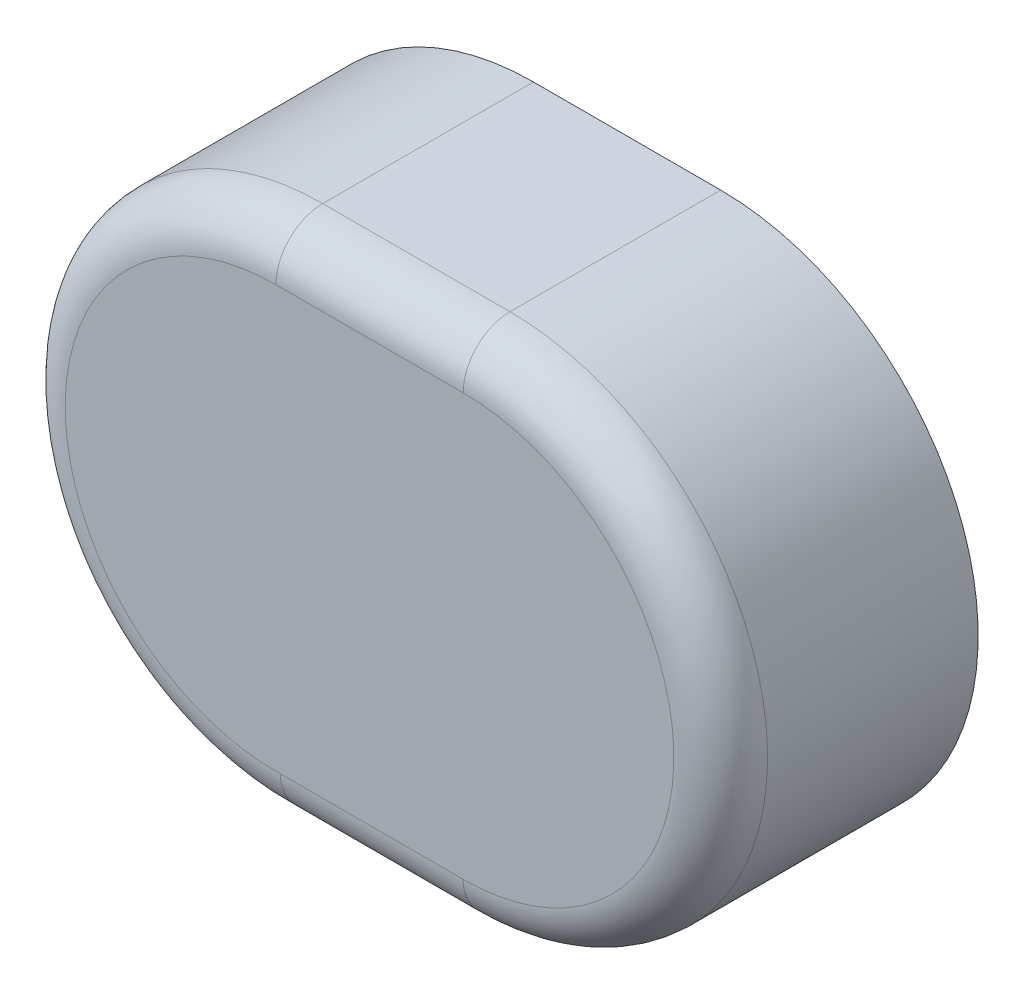
ISO-10303-21;
HEADER;
FILE_DESCRIPTION(('STEP AP214'),'2;1');
FILE_NAME('part.step','',(''),(''),'','','');
FILE_SCHEMA(('AUTOMOTIVE_DESIGN { 1 0 10303 214 1 1 1 1 }'));
ENDSEC;
DATA;
#1=APPLICATION_CONTEXT('core data for automotive mechanical design processes');
#2=APPLICATION_PROTOCOL_DEFINITION('international standard','automotive_design',2000,#1);
#3=PRODUCT_CONTEXT('',#1,'mechanical');
#4=PRODUCT('Part','Part','',(#3));
#5=PRODUCT_RELATED_PRODUCT_CATEGORY('part','',(#4));
#6=PRODUCT_DEFINITION_FORMATION('','',#4);
#7=PRODUCT_DEFINITION_CONTEXT('part definition',#1,'design');
#8=PRODUCT_DEFINITION('design','',#6,#7);
#9=PRODUCT_DEFINITION_SHAPE('','',#8);
#10=(LENGTH_UNIT() NAMED_UNIT(*) SI_UNIT(.MILLI.,.METRE.));
#11=(NAMED_UNIT(*) PLANE_ANGLE_UNIT() SI_UNIT($,.RADIAN.));
#12=(NAMED_UNIT(*) SI_UNIT($,.STERADIAN.) SOLID_ANGLE_UNIT());
#13=UNCERTAINTY_MEASURE_WITH_UNIT(LENGTH_MEASURE(1.E-05),#10,'distance_accuracy_value','');
#14=(GEOMETRIC_REPRESENTATION_CONTEXT(3) GLOBAL_UNCERTAINTY_ASSIGNED_CONTEXT((#13)) GLOBAL_UNIT_ASSIGNED_CONTEXT((#10,
#11,#12)) REPRESENTATION_CONTEXT('',''));
#15=CARTESIAN_POINT('',(0.,0.,0.));
#16=DIRECTION('',(0.,0.,1.));
#17=DIRECTION('',(1.,0.,0.));
#18=AXIS2_PLACEMENT_3D('',#15,#16,#17);
#19=CARTESIAN_POINT('',(-0.4,0.,1.1));
#20=DIRECTION('',(0.,0.,1.));
#21=DIRECTION('',(1.,0.,0.));
#22=AXIS2_PLACEMENT_3D('',#19,#20,#21);
#23=PLANE('',#22);
#24=DIRECTION('',(0.999999965445683,-0.000262885207739422,0.));
#25=VECTOR('',#24,1.);
#26=CARTESIAN_POINT('',(-0.380779125953,-0.899794729347,1.1));
#27=LINE('',#26,#25);
#28=CARTESIAN_POINT('',(-0.380779125953001,-0.899794729347,1.1));
#29=VERTEX_POINT('',#28);
#30=CARTESIAN_POINT('',(0.399474212285497,-0.899999846415,1.10000000000012));
#31=VERTEX_POINT('',#30);
#32=EDGE_CURVE('E66',#29,#31,#27,.T.);
#33=ORIENTED_EDGE('',*,*,#32,.T.);
#34=CARTESIAN_POINT('',(0.400000000000704,0.,1.10000000000023));
#35=DIRECTION('',(0.,0.,1.));
#36=DIRECTION('',(1.,0.,0.));
#37=AXIS2_PLACEMENT_3D('',#34,#35,#36);
#38=CIRCLE('',#37,0.900000075143295);
#39=CARTESIAN_POINT('',(0.4,0.9,1.1));
#40=VERTEX_POINT('',#39);
#41=EDGE_CURVE('E22',#31,#40,#38,.T.);
#42=ORIENTED_EDGE('',*,*,#41,.T.);
#43=DIRECTION('',(1.,0.,0.));
#44=VECTOR('',#43,1.);
#45=CARTESIAN_POINT('',(-0.4,0.9,1.1));
#46=LINE('',#45,#44);
#47=CARTESIAN_POINT('',(-0.4,0.899999999577645,1.1));
#48=VERTEX_POINT('',#47);
#49=EDGE_CURVE('E71',#40,#48,#46,.F.);
#50=ORIENTED_EDGE('',*,*,#49,.T.);
#51=CARTESIAN_POINT('',(-0.4,-2.02745806254789E-13,1.1));
#52=DIRECTION('',(0.,0.,1.));
#53=DIRECTION('',(1.,0.,0.));
#54=AXIS2_PLACEMENT_3D('',#51,#52,#53);
#55=CIRCLE('',#54,0.899999998310782);
#56=EDGE_CURVE('E74',#29,#48,#55,.F.);
#57=ORIENTED_EDGE('',*,*,#56,.F.);
#58=EDGE_LOOP('',(#33,#42,#50,#57));
#59=FACE_BOUND('',#58,.T.);
#60=ADVANCED_FACE('F17',(#59),#23,.T.);
#61=CARTESIAN_POINT('',(-0.4,-2.02745806254789E-13,0.9));
#62=DIRECTION('',(0.,0.,1.));
#63=DIRECTION('',(1.,0.,0.));
#64=AXIS2_PLACEMENT_3D('',#61,#62,#63);
#65=TOROIDAL_SURFACE('',#64,0.900000000000203,0.2);
#66=CARTESIAN_POINT('',(-0.4,0.9,0.9));
#67=DIRECTION('',(1.,0.,0.));
#68=DIRECTION('',(0.,1.,0.));
#69=AXIS2_PLACEMENT_3D('',#66,#67,#68);
#70=CIRCLE('',#69,0.2);
#71=CARTESIAN_POINT('',(-0.4,1.1,0.9));
#72=VERTEX_POINT('',#71);
#73=EDGE_CURVE('E83',#72,#48,#70,.T.);
#74=ORIENTED_EDGE('',*,*,#73,.F.);
#75=CARTESIAN_POINT('',(-0.4,0.,0.9));
#76=DIRECTION('',(0.,0.,-1.));
#77=DIRECTION('',(-1.,0.,0.));
#78=AXIS2_PLACEMENT_3D('',#75,#76,#77);
#79=CIRCLE('',#78,1.1);
#80=CARTESIAN_POINT('',(-0.378777908657648,-1.09979526405577,0.9));
#81=VERTEX_POINT('',#80);
#82=EDGE_CURVE('E82',#81,#72,#79,.T.);
#83=ORIENTED_EDGE('',*,*,#82,.F.);
#84=CARTESIAN_POINT('',(-0.378777908635561,-1.09979526405555,0.9));
#85=CARTESIAN_POINT('',(-0.378777842204827,-1.0998048210349,0.911250741551168));
#86=CARTESIAN_POINT('',(-0.378786937547882,-1.09884648962954,0.922498627818875));
#87=CARTESIAN_POINT('',(-0.378822962144186,-1.09506440034814,0.94466864361749));
#88=CARTESIAN_POINT('',(-0.378849879014467,-1.09224193773358,0.955590993838411));
#89=CARTESIAN_POINT('',(-0.378921075666668,-1.0847999385115,0.976811562049376));
#90=CARTESIAN_POINT('',(-0.378965363930232,-1.08017952405656,0.987109472314333));
#91=CARTESIAN_POINT('',(-0.379070341785508,-1.06927745845309,1.00678063740502));
#92=CARTESIAN_POINT('',(-0.379131026702489,-1.06299628080365,1.01615415473961));
#93=CARTESIAN_POINT('',(-0.379267506887356,-1.04895038107286,1.03371282067333));
#94=CARTESIAN_POINT('',(-0.379343300537055,-1.04118581786979,1.0418980963742));
#95=CARTESIAN_POINT('',(-0.379508386361887,-1.02438845910296,1.0568534085059));
#96=CARTESIAN_POINT('',(-0.379597685795761,-1.01535498174304,1.06362267920821));
#97=CARTESIAN_POINT('',(-0.379787778560933,-0.996274080809439,1.07555198563839));
#98=CARTESIAN_POINT('',(-0.379888579419048,-0.986225993750485,1.08071095920382));
#99=CARTESIAN_POINT('',(-0.380099088092223,-0.965421604535757,1.08925991942117));
#100=CARTESIAN_POINT('',(-0.380208779895724,-0.954666581816015,1.09265300787131));
#101=CARTESIAN_POINT('',(-0.380405318036238,-0.935573216478016,1.09695050093451));
#102=CARTESIAN_POINT('',(-0.380490769419831,-0.927326113091377,1.09827085569629));
#103=CARTESIAN_POINT('',(-0.38064402872097,-0.91263772837508,1.09969082850433));
#104=CARTESIAN_POINT('',(-0.380711385660316,-0.906216333564457,1.10000104534258));
#105=CARTESIAN_POINT('',(-0.380779125936381,-0.899794731036452,1.1));
#106=B_SPLINE_CURVE_WITH_KNOTS('',3,(#84,#85,#86,#87,#88,#89,#90,#91,#92,#93,#94,#95,#96,#97,
#98,#99,#100,#101,#102,#103,#104,#105),.UNSPECIFIED.,.F.,.F.,(4,2,2,2,2,2,2,2,2,2,4),(0.,
0.0337073897405711,0.0673913830505227,0.10109184319901,0.13478270537321,0.168469961102774,
0.202175386956016,0.23590299837384,0.269571165172142,0.29456536907765,0.313824089053903),.UNSPECIFIED.);
#107=EDGE_CURVE('E95',#29,#81,#106,.F.);
#108=ORIENTED_EDGE('',*,*,#107,.F.);
#109=ORIENTED_EDGE('',*,*,#56,.T.);
#110=EDGE_LOOP('',(#74,#83,#108,#109));
#111=FACE_BOUND('',#110,.T.);
#112=ADVANCED_FACE('F115',(#111),#65,.T.);
#113=CARTESIAN_POINT('',(-0.400236549181,-0.899789615799,0.9));
#114=DIRECTION('',(-0.999999965443406,0.000262893868867007,0.));
#115=DIRECTION('',(-0.000262893868867007,-0.999999965443406,0.));
#116=AXIS2_PLACEMENT_3D('',#113,#114,#115);
#117=CYLINDRICAL_SURFACE('',#116,0.2);
#118=ORIENTED_EDGE('',*,*,#107,.T.);
#119=DIRECTION('',(-0.999999965443406,0.000262893868867007,0.));
#120=VECTOR('',#119,1.);
#121=CARTESIAN_POINT('',(-0.378777908656,-1.099795264056,0.9));
#122=LINE('',#121,#120);
#123=CARTESIAN_POINT('',(0.399421633509,-1.09999984795121,0.9));
#124=VERTEX_POINT('',#123);
#125=EDGE_CURVE('E159',#81,#124,#122,.F.);
#126=ORIENTED_EDGE('',*,*,#125,.T.);
#127=CARTESIAN_POINT('',(0.399474212284995,-0.899999846415,1.10000000000025));
#128=CARTESIAN_POINT('',(0.399472848150148,-0.903272341829197,1.100000069418));
#129=CARTESIAN_POINT('',(0.399471490013461,-0.90654483133912,1.09991968342525));
#130=CARTESIAN_POINT('',(0.399468790259264,-0.913081929811225,1.09959849905725));
#131=CARTESIAN_POINT('',(0.399467448641755,-0.916346538773405,1.09935770068196));
#132=CARTESIAN_POINT('',(0.399464786448776,-0.92286000740981,1.09871618998729));
#133=CARTESIAN_POINT('',(0.399463465873306,-0.926108867084032,1.09831547766787));
#134=CARTESIAN_POINT('',(0.399460850189564,-0.932583011432703,1.09735512631835));
#135=CARTESIAN_POINT('',(0.399459555081291,-0.935808296107145,1.0967954872882));
#136=CARTESIAN_POINT('',(0.39945699467219,-0.9422275201756,1.09551862487333));
#137=CARTESIAN_POINT('',(0.399455729371362,-0.945421459569604,1.09480140148855));
#138=CARTESIAN_POINT('',(0.399453232816043,-0.951770298675267,1.09321109978944));
#139=CARTESIAN_POINT('',(0.399452001561552,-0.954925198386913,1.09233802147507));
#140=CARTESIAN_POINT('',(0.399449577228204,-0.961188357678076,1.09043811281793));
#141=CARTESIAN_POINT('',(0.399448384149348,-0.964296617257578,1.08941128247512));
#142=CARTESIAN_POINT('',(0.39944604017696,-0.970459008221036,1.08720634359814));
#143=CARTESIAN_POINT('',(0.399444889283429,-0.973513139604976,1.08602823506393));
#144=CARTESIAN_POINT('',(0.399442633562676,-0.979559916506415,1.08352357794058));
#145=CARTESIAN_POINT('',(0.399441528735454,-0.982552562023895,1.08219702935139));
#146=CARTESIAN_POINT('',(0.399439368890725,-0.988469157648223,1.07939868789792));
#147=CARTESIAN_POINT('',(0.399438313873218,-0.99139310775505,1.0779268950336));
#148=CARTESIAN_POINT('',(0.399436257245306,-0.997165268506623,1.07484161070562));
#149=CARTESIAN_POINT('',(0.399435255634901,-1.00001347915135,1.07322811924192));
#150=CARTESIAN_POINT('',(0.399433309264533,-1.00562729939037,1.06986332475802));
#151=CARTESIAN_POINT('',(0.39943236450457,-1.00839290898466,1.06811202173779));
#152=CARTESIAN_POINT('',(0.399430535116777,-1.01383486452759,1.06447582318303));
#153=CARTESIAN_POINT('',(0.399429650488946,-1.01651121047621,1.06259092764847));
#154=CARTESIAN_POINT('',(0.399427944478309,-1.02176819117654,1.05869208494355));
#155=CARTESIAN_POINT('',(0.399427123095503,-1.02434882592822,1.05667813777315));
#156=CARTESIAN_POINT('',(0.399425546512326,-1.02940816726002,1.05252604357167));
#157=CARTESIAN_POINT('',(0.399424791311955,-1.03188687384011,1.05038789654055));
#158=CARTESIAN_POINT('',(0.399423349849364,-1.03673638740797,1.04599255360112));
#159=CARTESIAN_POINT('',(0.399422663587144,-1.03910719439571,1.04373535769277));
#160=CARTESIAN_POINT('',(0.399421362569167,-1.04373519729767,1.03910735478152));
#161=CARTESIAN_POINT('',(0.399420747813409,-1.04599239321185,1.03673654777858));
#162=CARTESIAN_POINT('',(0.399419592184048,-1.05038773618451,1.03188703415988));
#163=CARTESIAN_POINT('',(0.399419051310444,-1.05252588324294,1.02940832754409));
#164=CARTESIAN_POINT('',(0.39941804562376,-1.05667797752102,1.02434898612101));
#165=CARTESIAN_POINT('',(0.399417580810681,-1.05869192474063,1.02176835131371));
#166=CARTESIAN_POINT('',(0.39941672922192,-1.06259076756625,1.0165113704829));
#167=CARTESIAN_POINT('',(0.399416342446238,-1.06447566317224,1.01383502445937));
#168=CARTESIAN_POINT('',(0.399415648703996,-1.0681118618924,1.0083930687481));
#169=CARTESIAN_POINT('',(0.399415341737436,-1.06986316500656,1.00562745906034));
#170=CARTESIAN_POINT('',(0.399414809176908,-1.07322795970105,1.00001363861659));
#171=CARTESIAN_POINT('',(0.399414583582939,-1.07484145128136,0.997165427860578));
#172=CARTESIAN_POINT('',(0.399414215120225,-1.07792673586547,0.991393266869477));
#173=CARTESIAN_POINT('',(0.399414072251479,-1.07939852886924,0.988469316634373));
#174=CARTESIAN_POINT('',(0.399413870378983,-1.0821968706246,0.982552720737414));
#175=CARTESIAN_POINT('',(0.399413811375233,-1.08352341937615,0.979560075075547));
#176=CARTESIAN_POINT('',(0.399413778158158,-1.08602807684726,0.973513297870186));
#177=CARTESIAN_POINT('',(0.399413803944833,-1.08720618556678,0.970459166326682));
#178=CARTESIAN_POINT('',(0.399413941018735,-1.08941112483735,0.964296775029929));
#179=CARTESIAN_POINT('',(0.399414052305963,-1.09043795538837,0.961188515276673));
#180=CARTESIAN_POINT('',(0.399414360875498,-1.0923378644848,0.954925355624867));
#181=CARTESIAN_POINT('',(0.399414558157805,-1.09321094303018,0.951770455726313));
#182=CARTESIAN_POINT('',(0.399415038996214,-1.09480124521401,0.945421616234783));
#183=CARTESIAN_POINT('',(0.399415322552316,-1.09551846885243,0.942227676641804));
#184=CARTESIAN_POINT('',(0.399415976003264,-1.09679533179708,0.935808452164476));
#185=CARTESIAN_POINT('',(0.399416345898108,-1.09735497110329,0.932583167280125));
#186=CARTESIAN_POINT('',(0.399417171873895,-1.09831532302714,0.926109022501889));
#187=CARTESIAN_POINT('',(0.399417627954836,-1.09871603564477,0.922860162608002));
#188=CARTESIAN_POINT('',(0.399418625953161,-1.09935754695772,0.916346693523734));
#189=CARTESIAN_POINT('',(0.399419167870544,-1.09959834565304,0.913082084333352));
#190=CARTESIAN_POINT('',(0.399420336927097,-1.09991953068254,0.906544985397571));
#191=CARTESIAN_POINT('',(0.399420964066266,-1.09999991701673,0.90327249565217));
#192=CARTESIAN_POINT('',(0.399421633509,-1.09999984795095,0.9));
#193=B_SPLINE_CURVE_WITH_KNOTS('',3,(#127,#128,#129,#130,#131,#132,#133,#134,#135,#136,#137,
#138,#139,#140,#141,#142,#143,#144,#145,#146,#147,#148,#149,#150,#151,#152,#153,#154,#155,#156,
#157,#158,#159,#160,#161,#162,#163,#164,#165,#166,#167,#168,#169,#170,#171,#172,#173,#174,#175,
#176,#177,#178,#179,#180,#181,#182,#183,#184,#185,#186,#187,#188,#189,#190,#191,#192),
.UNSPECIFIED.,.F.,.F.,(4,2,2,2,2,2,2,2,2,2,2,2,2,2,2,2,2,2,2,2,2,2,2,2,2,2,2,2,2,2,2,2,4),(0.,
0.00981649154818196,0.0196329830993919,0.0294494746536512,0.0392659662109736,0.0490824577713645,
0.0588989493348217,0.0687154409013335,0.0785319324708803,0.0883484240434333,0.0981649156189543,
0.107981407197398,0.117797898778707,0.127614390362817,0.137430881949655,0.147247373539137,
0.157063865131174,0.166880356725664,0.176696848322499,0.186513339921564,0.196329831522734,
0.206146323125877,0.215962814730857,0.225779306337527,0.235595797945736,0.245412289555329,
0.255228781166144,0.265045272778014,0.27486176439077,0.284678256004238,0.294494747618243,
0.304311239232608,0.314127730847152),.UNSPECIFIED.);
#194=EDGE_CURVE('E92',#31,#124,#193,.T.);
#195=ORIENTED_EDGE('',*,*,#194,.F.);
#196=ORIENTED_EDGE('',*,*,#32,.F.);
#197=EDGE_LOOP('',(#118,#126,#195,#196));
#198=FACE_BOUND('',#197,.T.);
#199=ADVANCED_FACE('F111',(#198),#117,.T.);
#200=CARTESIAN_POINT('',(0.400000000000704,0.,0.9));
#201=DIRECTION('',(0.,0.,1.));
#202=DIRECTION('',(1.,0.,0.));
#203=AXIS2_PLACEMENT_3D('',#200,#201,#202);
#204=TOROIDAL_SURFACE('',#203,0.899999999999712,0.200000000000248);
#205=ORIENTED_EDGE('',*,*,#194,.T.);
#206=CARTESIAN_POINT('',(0.4,0.,0.9));
#207=DIRECTION('',(0.,0.,-1.));
#208=DIRECTION('',(-1.,0.,0.));
#209=AXIS2_PLACEMENT_3D('',#206,#207,#208);
#210=CIRCLE('',#209,1.1);
#211=CARTESIAN_POINT('',(0.4,1.1,0.9));
#212=VERTEX_POINT('',#211);
#213=EDGE_CURVE('E79',#212,#124,#210,.T.);
#214=ORIENTED_EDGE('',*,*,#213,.F.);
#215=CARTESIAN_POINT('',(0.4,0.899999999999999,0.9));
#216=DIRECTION('',(1.,0.,0.));
#217=DIRECTION('',(0.,1.,0.));
#218=AXIS2_PLACEMENT_3D('',#215,#216,#217);
#219=CIRCLE('',#218,0.2);
#220=EDGE_CURVE('E77',#40,#212,#219,.F.);
#221=ORIENTED_EDGE('',*,*,#220,.F.);
#222=ORIENTED_EDGE('',*,*,#41,.F.);
#223=EDGE_LOOP('',(#205,#214,#221,#222));
#224=FACE_BOUND('',#223,.T.);
#225=ADVANCED_FACE('F19',(#224),#204,.T.);
#226=CARTESIAN_POINT('',(-0.4,0.9,0.9));
#227=DIRECTION('',(1.,0.,0.));
#228=DIRECTION('',(0.,1.,0.));
#229=AXIS2_PLACEMENT_3D('',#226,#227,#228);
#230=CYLINDRICAL_SURFACE('',#229,0.2);
#231=ORIENTED_EDGE('',*,*,#220,.T.);
#232=DIRECTION('',(1.,0.,0.));
#233=VECTOR('',#232,1.);
#234=CARTESIAN_POINT('',(0.4,1.1,0.9));
#235=LINE('',#234,#233);
#236=EDGE_CURVE('E106',#212,#72,#235,.F.);
#237=ORIENTED_EDGE('',*,*,#236,.T.);
#238=ORIENTED_EDGE('',*,*,#73,.T.);
#239=ORIENTED_EDGE('',*,*,#49,.F.);
#240=EDGE_LOOP('',(#231,#237,#238,#239));
#241=FACE_BOUND('',#240,.T.);
#242=ADVANCED_FACE('F86',(#241),#230,.T.);
#243=CARTESIAN_POINT('',(-0.4,0.,1.1));
#244=DIRECTION('',(0.,0.,-1.));
#245=DIRECTION('',(-1.,0.,0.));
#246=AXIS2_PLACEMENT_3D('',#243,#244,#245);
#247=CYLINDRICAL_SURFACE('',#246,1.1);
#248=CARTESIAN_POINT('',(-0.4,0.,0.));
#249=DIRECTION('',(0.,0.,-1.));
#250=DIRECTION('',(-1.,0.,0.));
#251=AXIS2_PLACEMENT_3D('',#248,#249,#250);
#252=CIRCLE('',#251,1.1);
#253=CARTESIAN_POINT('',(-0.4,1.1,0.));
#254=VERTEX_POINT('',#253);
#255=CARTESIAN_POINT('',(-0.378777908667865,-1.099795264056,0.));
#256=VERTEX_POINT('',#255);
#257=EDGE_CURVE('E104',#254,#256,#252,.F.);
#258=ORIENTED_EDGE('',*,*,#257,.T.);
#259=DIRECTION('',(0.,0.,1.));
#260=VECTOR('',#259,1.);
#261=CARTESIAN_POINT('',(-0.378777908656,-1.099795264056,1.1));
#262=LINE('',#261,#260);
#263=EDGE_CURVE('E164',#256,#81,#262,.T.);
#264=ORIENTED_EDGE('',*,*,#263,.T.);
#265=ORIENTED_EDGE('',*,*,#82,.T.);
#266=DIRECTION('',(0.,0.,1.));
#267=VECTOR('',#266,1.);
#268=CARTESIAN_POINT('',(-0.4,1.1,1.1));
#269=LINE('',#268,#267);
#270=EDGE_CURVE('E185',#72,#254,#269,.F.);
#271=ORIENTED_EDGE('',*,*,#270,.T.);
#272=EDGE_LOOP('',(#258,#264,#265,#271));
#273=FACE_BOUND('',#272,.T.);
#274=ADVANCED_FACE('F141',(#273),#247,.T.);
#275=CARTESIAN_POINT('',(-0.378777908656,-1.099795264056,1.1));
#276=DIRECTION('',(0.000262893868867007,0.999999965443406,0.));
#277=DIRECTION('',(-0.999999965443406,0.000262893868867007,0.));
#278=AXIS2_PLACEMENT_3D('',#275,#276,#277);
#279=PLANE('',#278);
#280=ORIENTED_EDGE('',*,*,#263,.F.);
#281=DIRECTION('',(0.999999965443407,-0.000262893868275906,0.));
#282=VECTOR('',#281,1.);
#283=CARTESIAN_POINT('',(-0.378777908656,-1.099795264056,0.));
#284=LINE('',#283,#282);
#285=CARTESIAN_POINT('',(0.399421633509001,-1.09999984795099,0.));
#286=VERTEX_POINT('',#285);
#287=EDGE_CURVE('E103',#256,#286,#284,.T.);
#288=ORIENTED_EDGE('',*,*,#287,.T.);
#289=DIRECTION('',(0.,0.,-1.));
#290=VECTOR('',#289,1.);
#291=CARTESIAN_POINT('',(0.399421633509001,-1.09999984795099,1.1));
#292=LINE('',#291,#290);
#293=EDGE_CURVE('E170',#124,#286,#292,.T.);
#294=ORIENTED_EDGE('',*,*,#293,.F.);
#295=ORIENTED_EDGE('',*,*,#125,.F.);
#296=EDGE_LOOP('',(#280,#288,#294,#295));
#297=FACE_BOUND('',#296,.T.);
#298=ADVANCED_FACE('F137',(#297),#279,.F.);
#299=CARTESIAN_POINT('',(0.4,0.,1.1));
#300=DIRECTION('',(0.,0.,-1.));
#301=DIRECTION('',(-1.,0.,0.));
#302=AXIS2_PLACEMENT_3D('',#299,#300,#301);
#303=CYLINDRICAL_SURFACE('',#302,1.1);
#304=DIRECTION('',(0.,0.,1.));
#305=VECTOR('',#304,1.);
#306=CARTESIAN_POINT('',(0.4,1.1,1.1));
#307=LINE('',#306,#305);
#308=CARTESIAN_POINT('',(0.4,1.1,0.));
#309=VERTEX_POINT('',#308);
#310=EDGE_CURVE('E36',#309,#212,#307,.T.);
#311=ORIENTED_EDGE('',*,*,#310,.T.);
#312=ORIENTED_EDGE('',*,*,#213,.T.);
#313=ORIENTED_EDGE('',*,*,#293,.T.);
#314=CARTESIAN_POINT('',(0.4,0.,0.));
#315=DIRECTION('',(0.,0.,-1.));
#316=DIRECTION('',(-1.,0.,0.));
#317=AXIS2_PLACEMENT_3D('',#314,#315,#316);
#318=CIRCLE('',#317,1.1);
#319=EDGE_CURVE('E28',#286,#309,#318,.F.);
#320=ORIENTED_EDGE('',*,*,#319,.T.);
#321=EDGE_LOOP('',(#311,#312,#313,#320));
#322=FACE_BOUND('',#321,.T.);
#323=ADVANCED_FACE('F131',(#322),#303,.T.);
#324=CARTESIAN_POINT('',(0.4,1.1,1.1));
#325=DIRECTION('',(0.,-1.,0.));
#326=DIRECTION('',(1.,0.,0.));
#327=AXIS2_PLACEMENT_3D('',#324,#325,#326);
#328=PLANE('',#327);
#329=ORIENTED_EDGE('',*,*,#310,.F.);
#330=DIRECTION('',(1.,0.,0.));
#331=VECTOR('',#330,1.);
#332=CARTESIAN_POINT('',(-0.4,1.1,0.));
#333=LINE('',#332,#331);
#334=EDGE_CURVE('E11',#309,#254,#333,.F.);
#335=ORIENTED_EDGE('',*,*,#334,.T.);
#336=ORIENTED_EDGE('',*,*,#270,.F.);
#337=ORIENTED_EDGE('',*,*,#236,.F.);
#338=EDGE_LOOP('',(#329,#335,#336,#337));
#339=FACE_BOUND('',#338,.T.);
#340=ADVANCED_FACE('F125',(#339),#328,.F.);
#341=CARTESIAN_POINT('',(-0.4,0.,0.));
#342=DIRECTION('',(0.,0.,1.));
#343=DIRECTION('',(1.,0.,0.));
#344=AXIS2_PLACEMENT_3D('',#341,#342,#343);
#345=PLANE('',#344);
#346=ORIENTED_EDGE('',*,*,#319,.F.);
#347=ORIENTED_EDGE('',*,*,#287,.F.);
#348=ORIENTED_EDGE('',*,*,#257,.F.);
#349=ORIENTED_EDGE('',*,*,#334,.F.);
#350=EDGE_LOOP('',(#346,#347,#348,#349));
#351=FACE_BOUND('',#350,.T.);
#352=ADVANCED_FACE('F123',(#351),#345,.F.);
#353=CLOSED_SHELL('',(#60,#112,#199,#225,#242,#274,#298,#323,#340,#352));
#354=MANIFOLD_SOLID_BREP('B1',#353);
#355=ADVANCED_BREP_SHAPE_REPRESENTATION('',(#18,#354),#14);
#356=SHAPE_DEFINITION_REPRESENTATION(#9,#355);
ENDSEC;
END-ISO-10303-21;
